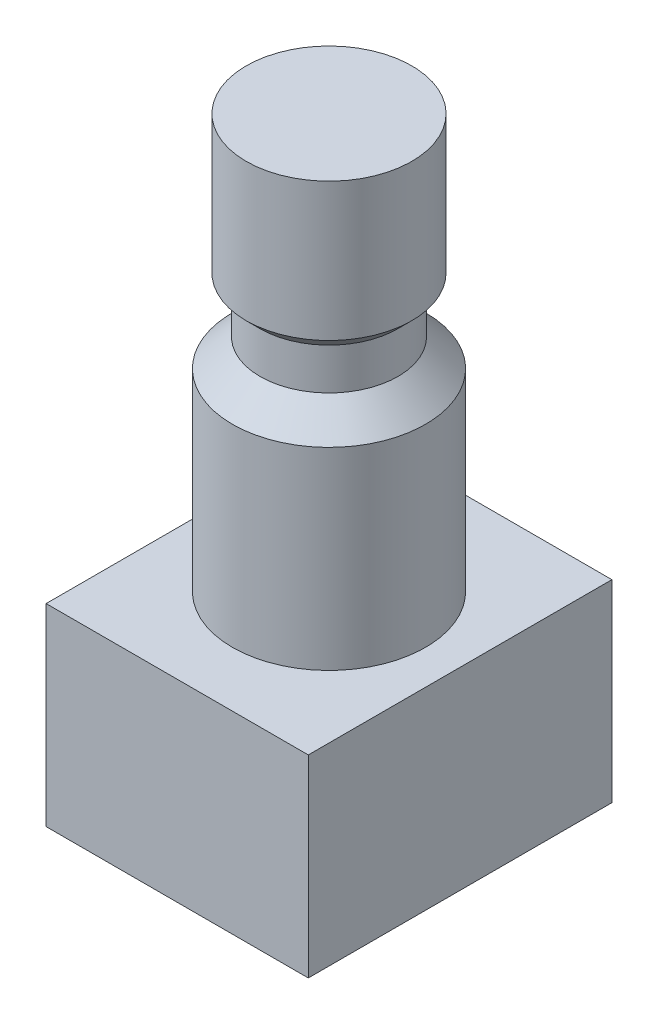
ISO-10303-21;
HEADER;
FILE_DESCRIPTION(('STEP AP214'),'2;1');
FILE_NAME('part.step','',(''),(''),'','','');
FILE_SCHEMA(('AUTOMOTIVE_DESIGN { 1 0 10303 214 1 1 1 1 }'));
ENDSEC;
DATA;
#1=APPLICATION_CONTEXT('core data for automotive mechanical design processes');
#2=APPLICATION_PROTOCOL_DEFINITION('international standard','automotive_design',2000,#1);
#3=PRODUCT_CONTEXT('',#1,'mechanical');
#4=PRODUCT('Part','Part','',(#3));
#5=PRODUCT_RELATED_PRODUCT_CATEGORY('part','',(#4));
#6=PRODUCT_DEFINITION_FORMATION('','',#4);
#7=PRODUCT_DEFINITION_CONTEXT('part definition',#1,'design');
#8=PRODUCT_DEFINITION('design','',#6,#7);
#9=PRODUCT_DEFINITION_SHAPE('','',#8);
#10=(LENGTH_UNIT() NAMED_UNIT(*) SI_UNIT(.MILLI.,.METRE.));
#11=(NAMED_UNIT(*) PLANE_ANGLE_UNIT() SI_UNIT($,.RADIAN.));
#12=(NAMED_UNIT(*) SI_UNIT($,.STERADIAN.) SOLID_ANGLE_UNIT());
#13=UNCERTAINTY_MEASURE_WITH_UNIT(LENGTH_MEASURE(1.E-05),#10,'distance_accuracy_value','');
#14=(GEOMETRIC_REPRESENTATION_CONTEXT(3) GLOBAL_UNCERTAINTY_ASSIGNED_CONTEXT((#13)) GLOBAL_UNIT_ASSIGNED_CONTEXT((#10,
#11,#12)) REPRESENTATION_CONTEXT('',''));
#15=CARTESIAN_POINT('',(0.,0.,0.));
#16=DIRECTION('',(0.,0.,1.));
#17=DIRECTION('',(1.,0.,0.));
#18=AXIS2_PLACEMENT_3D('',#15,#16,#17);
#19=CARTESIAN_POINT('',(-4.75,-7.,5.5));
#20=DIRECTION('',(-1.,0.,0.));
#21=DIRECTION('',(0.,0.,1.));
#22=AXIS2_PLACEMENT_3D('',#19,#20,#21);
#23=PLANE('',#22);
#24=DIRECTION('',(0.,0.,1.));
#25=VECTOR('',#24,1.);
#26=CARTESIAN_POINT('',(-4.75,0.,5.5));
#27=LINE('',#26,#25);
#28=CARTESIAN_POINT('',(-4.75,0.,-5.5));
#29=VERTEX_POINT('',#28);
#30=CARTESIAN_POINT('',(-4.75,0.,5.5));
#31=VERTEX_POINT('',#30);
#32=EDGE_CURVE('E104',#29,#31,#27,.T.);
#33=ORIENTED_EDGE('',*,*,#32,.F.);
#34=DIRECTION('',(0.,1.,0.));
#35=VECTOR('',#34,1.);
#36=CARTESIAN_POINT('',(-4.75,-7.,-5.5));
#37=LINE('',#36,#35);
#38=CARTESIAN_POINT('',(-4.75,-7.,-5.5));
#39=VERTEX_POINT('',#38);
#40=EDGE_CURVE('E46',#39,#29,#37,.T.);
#41=ORIENTED_EDGE('',*,*,#40,.F.);
#42=DIRECTION('',(0.,0.,1.));
#43=VECTOR('',#42,1.);
#44=CARTESIAN_POINT('',(-4.75,-7.,5.5));
#45=LINE('',#44,#43);
#46=CARTESIAN_POINT('',(-4.75,-7.,5.5));
#47=VERTEX_POINT('',#46);
#48=EDGE_CURVE('E97',#39,#47,#45,.T.);
#49=ORIENTED_EDGE('',*,*,#48,.T.);
#50=DIRECTION('',(0.,1.,0.));
#51=VECTOR('',#50,1.);
#52=CARTESIAN_POINT('',(-4.75,-7.,5.5));
#53=LINE('',#52,#51);
#54=EDGE_CURVE('E40',#47,#31,#53,.T.);
#55=ORIENTED_EDGE('',*,*,#54,.T.);
#56=EDGE_LOOP('',(#33,#41,#49,#55));
#57=FACE_BOUND('',#56,.T.);
#58=ADVANCED_FACE('F37',(#57),#23,.T.);
#59=CARTESIAN_POINT('',(-4.75,-7.,-5.5));
#60=DIRECTION('',(0.,0.,-1.));
#61=DIRECTION('',(-1.,0.,0.));
#62=AXIS2_PLACEMENT_3D('',#59,#60,#61);
#63=PLANE('',#62);
#64=DIRECTION('',(-1.,0.,0.));
#65=VECTOR('',#64,1.);
#66=CARTESIAN_POINT('',(-4.75,0.,-5.5));
#67=LINE('',#66,#65);
#68=CARTESIAN_POINT('',(4.75,0.,-5.5));
#69=VERTEX_POINT('',#68);
#70=EDGE_CURVE('E99',#69,#29,#67,.T.);
#71=ORIENTED_EDGE('',*,*,#70,.F.);
#72=DIRECTION('',(0.,1.,0.));
#73=VECTOR('',#72,1.);
#74=CARTESIAN_POINT('',(4.75,-7.,-5.5));
#75=LINE('',#74,#73);
#76=CARTESIAN_POINT('',(4.75,-7.,-5.5));
#77=VERTEX_POINT('',#76);
#78=EDGE_CURVE('E71',#77,#69,#75,.T.);
#79=ORIENTED_EDGE('',*,*,#78,.F.);
#80=DIRECTION('',(-1.,0.,0.));
#81=VECTOR('',#80,1.);
#82=CARTESIAN_POINT('',(-4.75,-7.,-5.5));
#83=LINE('',#82,#81);
#84=EDGE_CURVE('E94',#77,#39,#83,.T.);
#85=ORIENTED_EDGE('',*,*,#84,.T.);
#86=ORIENTED_EDGE('',*,*,#40,.T.);
#87=EDGE_LOOP('',(#71,#79,#85,#86));
#88=FACE_BOUND('',#87,.T.);
#89=ADVANCED_FACE('F116',(#88),#63,.T.);
#90=CARTESIAN_POINT('',(4.75,-7.,5.5));
#91=DIRECTION('',(1.,0.,0.));
#92=DIRECTION('',(0.,0.,-1.));
#93=AXIS2_PLACEMENT_3D('',#90,#91,#92);
#94=PLANE('',#93);
#95=DIRECTION('',(0.,0.,-1.));
#96=VECTOR('',#95,1.);
#97=CARTESIAN_POINT('',(4.75,0.,5.5));
#98=LINE('',#97,#96);
#99=CARTESIAN_POINT('',(4.75,0.,5.5));
#100=VERTEX_POINT('',#99);
#101=EDGE_CURVE('E89',#100,#69,#98,.T.);
#102=ORIENTED_EDGE('',*,*,#101,.F.);
#103=DIRECTION('',(0.,1.,0.));
#104=VECTOR('',#103,1.);
#105=CARTESIAN_POINT('',(4.75,-7.,5.5));
#106=LINE('',#105,#104);
#107=CARTESIAN_POINT('',(4.75,-7.,5.5));
#108=VERTEX_POINT('',#107);
#109=EDGE_CURVE('E84',#108,#100,#106,.T.);
#110=ORIENTED_EDGE('',*,*,#109,.F.);
#111=DIRECTION('',(0.,0.,-1.));
#112=VECTOR('',#111,1.);
#113=CARTESIAN_POINT('',(4.75,-7.,5.5));
#114=LINE('',#113,#112);
#115=EDGE_CURVE('E87',#108,#77,#114,.T.);
#116=ORIENTED_EDGE('',*,*,#115,.T.);
#117=ORIENTED_EDGE('',*,*,#78,.T.);
#118=EDGE_LOOP('',(#102,#110,#116,#117));
#119=FACE_BOUND('',#118,.T.);
#120=ADVANCED_FACE('F86',(#119),#94,.T.);
#121=CARTESIAN_POINT('',(-4.75,-7.,5.5));
#122=DIRECTION('',(0.,0.,1.));
#123=DIRECTION('',(1.,0.,0.));
#124=AXIS2_PLACEMENT_3D('',#121,#122,#123);
#125=PLANE('',#124);
#126=DIRECTION('',(1.,0.,0.));
#127=VECTOR('',#126,1.);
#128=CARTESIAN_POINT('',(-4.75,0.,5.5));
#129=LINE('',#128,#127);
#130=EDGE_CURVE('E107',#31,#100,#129,.T.);
#131=ORIENTED_EDGE('',*,*,#130,.F.);
#132=ORIENTED_EDGE('',*,*,#54,.F.);
#133=DIRECTION('',(1.,0.,0.));
#134=VECTOR('',#133,1.);
#135=CARTESIAN_POINT('',(-4.75,-7.,5.5));
#136=LINE('',#135,#134);
#137=EDGE_CURVE('E93',#47,#108,#136,.T.);
#138=ORIENTED_EDGE('',*,*,#137,.T.);
#139=ORIENTED_EDGE('',*,*,#109,.T.);
#140=EDGE_LOOP('',(#131,#132,#138,#139));
#141=FACE_BOUND('',#140,.T.);
#142=ADVANCED_FACE('F96',(#141),#125,.T.);
#143=CARTESIAN_POINT('',(0.,-7.,0.));
#144=DIRECTION('',(0.,-1.,0.));
#145=DIRECTION('',(0.,0.,-1.));
#146=AXIS2_PLACEMENT_3D('',#143,#144,#145);
#147=PLANE('',#146);
#148=ORIENTED_EDGE('',*,*,#48,.F.);
#149=ORIENTED_EDGE('',*,*,#84,.F.);
#150=ORIENTED_EDGE('',*,*,#115,.F.);
#151=ORIENTED_EDGE('',*,*,#137,.F.);
#152=EDGE_LOOP('',(#148,#149,#150,#151));
#153=FACE_BOUND('',#152,.T.);
#154=ADVANCED_FACE('F92',(#153),#147,.T.);
#155=CARTESIAN_POINT('',(0.,0.,0.));
#156=DIRECTION('',(0.,-1.,0.));
#157=DIRECTION('',(0.,0.,-1.));
#158=AXIS2_PLACEMENT_3D('',#155,#156,#157);
#159=PLANE('',#158);
#160=CARTESIAN_POINT('',(0.,0.,0.));
#161=DIRECTION('',(0.,1.,0.));
#162=DIRECTION('',(0.,0.,1.));
#163=AXIS2_PLACEMENT_3D('',#160,#161,#162);
#164=CIRCLE('',#163,3.5);
#165=CARTESIAN_POINT('',(0.,0.,3.5));
#166=VERTEX_POINT('',#165);
#167=EDGE_CURVE('E11',#166,#166,#164,.T.);
#168=ORIENTED_EDGE('',*,*,#167,.F.);
#169=EDGE_LOOP('',(#168));
#170=FACE_BOUND('',#169,.T.);
#171=ORIENTED_EDGE('',*,*,#32,.T.);
#172=ORIENTED_EDGE('',*,*,#130,.T.);
#173=ORIENTED_EDGE('',*,*,#101,.T.);
#174=ORIENTED_EDGE('',*,*,#70,.T.);
#175=EDGE_LOOP('',(#171,#172,#173,#174));
#176=FACE_BOUND('',#175,.T.);
#177=ADVANCED_FACE('F115',(#170,#176),#159,.F.);
#178=CARTESIAN_POINT('',(0.,15.,0.));
#179=DIRECTION('',(0.,-1.,0.));
#180=DIRECTION('',(0.,0.,-1.));
#181=AXIS2_PLACEMENT_3D('',#178,#179,#180);
#182=PLANE('',#181);
#183=CARTESIAN_POINT('',(0.,15.,0.));
#184=DIRECTION('',(0.,1.,0.));
#185=DIRECTION('',(0.,0.,1.));
#186=AXIS2_PLACEMENT_3D('',#183,#184,#185);
#187=CIRCLE('',#186,3.);
#188=CARTESIAN_POINT('',(0.,15.,3.));
#189=VERTEX_POINT('',#188);
#190=EDGE_CURVE('E108',#189,#189,#187,.T.);
#191=ORIENTED_EDGE('',*,*,#190,.T.);
#192=EDGE_LOOP('',(#191));
#193=FACE_BOUND('',#192,.T.);
#194=ADVANCED_FACE('F133',(#193),#182,.F.);
#195=CARTESIAN_POINT('',(0.,0.,0.));
#196=DIRECTION('',(0.,1.,0.));
#197=DIRECTION('',(0.,0.,1.));
#198=AXIS2_PLACEMENT_3D('',#195,#196,#197);
#199=CYLINDRICAL_SURFACE('',#198,3.);
#200=ORIENTED_EDGE('',*,*,#190,.F.);
#201=EDGE_LOOP('',(#200));
#202=FACE_BOUND('',#201,.T.);
#203=CARTESIAN_POINT('',(0.,10.,0.));
#204=DIRECTION('',(0.,1.,0.));
#205=DIRECTION('',(0.,0.,1.));
#206=AXIS2_PLACEMENT_3D('',#203,#204,#205);
#207=CIRCLE('',#206,3.);
#208=CARTESIAN_POINT('',(0.,10.,3.));
#209=VERTEX_POINT('',#208);
#210=EDGE_CURVE('E175',#209,#209,#207,.T.);
#211=ORIENTED_EDGE('',*,*,#210,.T.);
#212=EDGE_LOOP('',(#211));
#213=FACE_BOUND('',#212,.T.);
#214=ADVANCED_FACE('F138',(#202,#213),#199,.T.);
#215=CARTESIAN_POINT('',(0.,9.5,0.));
#216=DIRECTION('',(0.,1.,0.));
#217=DIRECTION('',(0.,0.,1.));
#218=AXIS2_PLACEMENT_3D('',#215,#216,#217);
#219=CONICAL_SURFACE('',#218,2.5,0.78539816339745);
#220=ORIENTED_EDGE('',*,*,#210,.F.);
#221=EDGE_LOOP('',(#220));
#222=FACE_BOUND('',#221,.T.);
#223=CARTESIAN_POINT('',(0.,9.5,0.));
#224=DIRECTION('',(0.,1.,0.));
#225=DIRECTION('',(0.,0.,1.));
#226=AXIS2_PLACEMENT_3D('',#223,#224,#225);
#227=CIRCLE('',#226,2.5);
#228=CARTESIAN_POINT('',(0.,9.5,2.5));
#229=VERTEX_POINT('',#228);
#230=EDGE_CURVE('E170',#229,#229,#227,.T.);
#231=ORIENTED_EDGE('',*,*,#230,.T.);
#232=EDGE_LOOP('',(#231));
#233=FACE_BOUND('',#232,.T.);
#234=ADVANCED_FACE('F142',(#222,#233),#219,.T.);
#235=CARTESIAN_POINT('',(0.,0.,0.));
#236=DIRECTION('',(0.,1.,0.));
#237=DIRECTION('',(0.,0.,1.));
#238=AXIS2_PLACEMENT_3D('',#235,#236,#237);
#239=CYLINDRICAL_SURFACE('',#238,2.5);
#240=ORIENTED_EDGE('',*,*,#230,.F.);
#241=EDGE_LOOP('',(#240));
#242=FACE_BOUND('',#241,.T.);
#243=CARTESIAN_POINT('',(0.,8.,0.));
#244=DIRECTION('',(0.,1.,0.));
#245=DIRECTION('',(0.,0.,1.));
#246=AXIS2_PLACEMENT_3D('',#243,#244,#245);
#247=CIRCLE('',#246,2.5);
#248=CARTESIAN_POINT('',(0.,8.,2.5));
#249=VERTEX_POINT('',#248);
#250=EDGE_CURVE('E167',#249,#249,#247,.T.);
#251=ORIENTED_EDGE('',*,*,#250,.T.);
#252=EDGE_LOOP('',(#251));
#253=FACE_BOUND('',#252,.T.);
#254=ADVANCED_FACE('F146',(#242,#253),#239,.T.);
#255=CARTESIAN_POINT('',(0.,7.,0.));
#256=DIRECTION('',(0.,-1.,0.));
#257=DIRECTION('',(0.,0.,-1.));
#258=AXIS2_PLACEMENT_3D('',#255,#256,#257);
#259=CONICAL_SURFACE('',#258,3.5,0.785398163397447);
#260=ORIENTED_EDGE('',*,*,#250,.F.);
#261=EDGE_LOOP('',(#260));
#262=FACE_BOUND('',#261,.T.);
#263=CARTESIAN_POINT('',(0.,7.,0.));
#264=DIRECTION('',(0.,1.,0.));
#265=DIRECTION('',(0.,0.,1.));
#266=AXIS2_PLACEMENT_3D('',#263,#264,#265);
#267=CIRCLE('',#266,3.5);
#268=CARTESIAN_POINT('',(0.,7.,3.5));
#269=VERTEX_POINT('',#268);
#270=EDGE_CURVE('E163',#269,#269,#267,.T.);
#271=ORIENTED_EDGE('',*,*,#270,.T.);
#272=EDGE_LOOP('',(#271));
#273=FACE_BOUND('',#272,.T.);
#274=ADVANCED_FACE('F150',(#262,#273),#259,.T.);
#275=CARTESIAN_POINT('',(0.,0.,0.));
#276=DIRECTION('',(0.,1.,0.));
#277=DIRECTION('',(0.,0.,1.));
#278=AXIS2_PLACEMENT_3D('',#275,#276,#277);
#279=CYLINDRICAL_SURFACE('',#278,3.5);
#280=ORIENTED_EDGE('',*,*,#270,.F.);
#281=EDGE_LOOP('',(#280));
#282=FACE_BOUND('',#281,.T.);
#283=ORIENTED_EDGE('',*,*,#167,.T.);
#284=EDGE_LOOP('',(#283));
#285=FACE_BOUND('',#284,.T.);
#286=ADVANCED_FACE('F154',(#282,#285),#279,.T.);
#287=CLOSED_SHELL('',(#58,#89,#120,#142,#154,#177,#194,#214,#234,#254,#274,#286));
#288=MANIFOLD_SOLID_BREP('B2',#287);
#289=ADVANCED_BREP_SHAPE_REPRESENTATION('',(#18,#288),#14);
#290=SHAPE_DEFINITION_REPRESENTATION(#9,#289);
ENDSEC;
END-ISO-10303-21;
